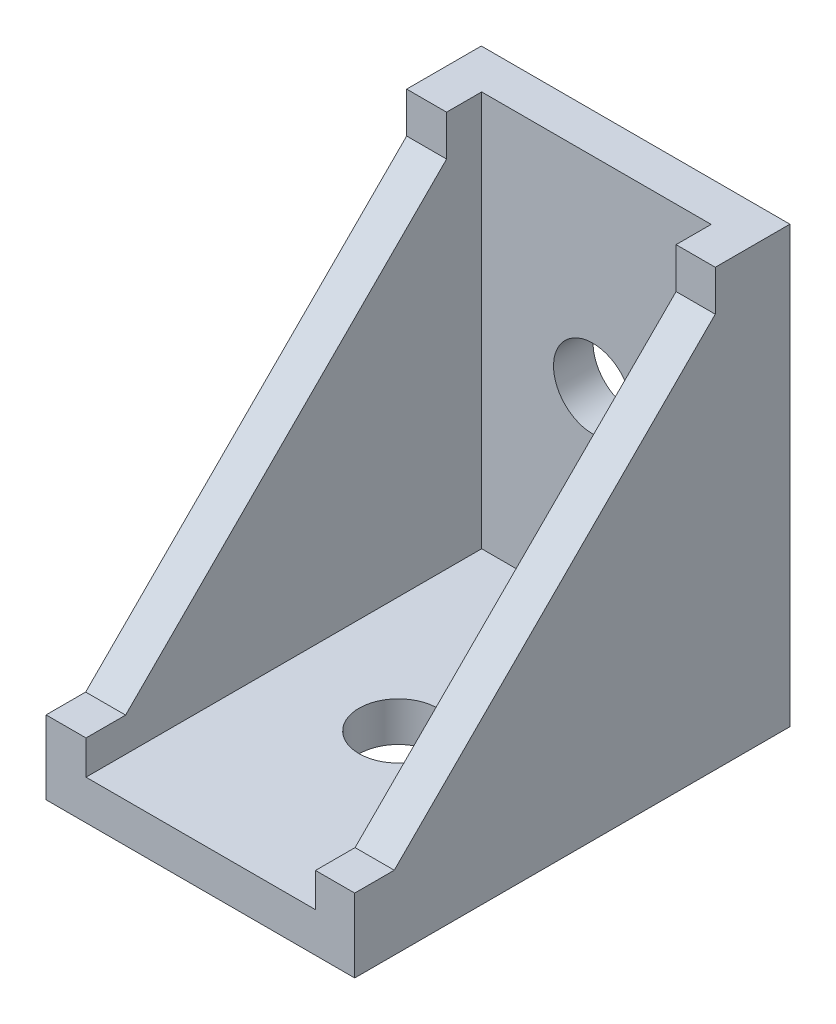
ISO-10303-21;
HEADER;
FILE_DESCRIPTION(('STEP AP214'),'2;1');
FILE_NAME('part.step','',(''),(''),'','','');
FILE_SCHEMA(('AUTOMOTIVE_DESIGN { 1 0 10303 214 1 1 1 1 }'));
ENDSEC;
DATA;
#1=APPLICATION_CONTEXT('core data for automotive mechanical design processes');
#2=APPLICATION_PROTOCOL_DEFINITION('international standard','automotive_design',2000,#1);
#3=PRODUCT_CONTEXT('',#1,'mechanical');
#4=PRODUCT('Part','Part','',(#3));
#5=PRODUCT_RELATED_PRODUCT_CATEGORY('part','',(#4));
#6=PRODUCT_DEFINITION_FORMATION('','',#4);
#7=PRODUCT_DEFINITION_CONTEXT('part definition',#1,'design');
#8=PRODUCT_DEFINITION('design','',#6,#7);
#9=PRODUCT_DEFINITION_SHAPE('','',#8);
#10=(LENGTH_UNIT() NAMED_UNIT(*) SI_UNIT(.MILLI.,.METRE.));
#11=(NAMED_UNIT(*) PLANE_ANGLE_UNIT() SI_UNIT($,.RADIAN.));
#12=(NAMED_UNIT(*) SI_UNIT($,.STERADIAN.) SOLID_ANGLE_UNIT());
#13=UNCERTAINTY_MEASURE_WITH_UNIT(LENGTH_MEASURE(1.E-05),#10,'distance_accuracy_value','');
#14=(GEOMETRIC_REPRESENTATION_CONTEXT(3) GLOBAL_UNCERTAINTY_ASSIGNED_CONTEXT((#13)) GLOBAL_UNIT_ASSIGNED_CONTEXT((#10,
#11,#12)) REPRESENTATION_CONTEXT('',''));
#15=CARTESIAN_POINT('',(0.,0.,0.));
#16=DIRECTION('',(0.,0.,1.));
#17=DIRECTION('',(1.,0.,0.));
#18=AXIS2_PLACEMENT_3D('',#15,#16,#17);
#19=CARTESIAN_POINT('',(0.,0.,27.94));
#20=DIRECTION('',(1.,0.,0.));
#21=DIRECTION('',(0.,1.,0.));
#22=AXIS2_PLACEMENT_3D('',#19,#20,#21);
#23=PLANE('',#22);
#24=DIRECTION('',(0.,0.,1.));
#25=VECTOR('',#24,1.);
#26=CARTESIAN_POINT('',(0.,-23.2176660016532,27.94));
#27=LINE('',#26,#25);
#28=CARTESIAN_POINT('',(0.,-23.2176660016532,25.4));
#29=VERTEX_POINT('',#28);
#30=CARTESIAN_POINT('',(0.,-23.2176660016532,27.94));
#31=VERTEX_POINT('',#30);
#32=EDGE_CURVE('E51',#29,#31,#27,.T.);
#33=ORIENTED_EDGE('',*,*,#32,.F.);
#34=DIRECTION('',(0.,-0.707106781186549,0.707106781186546));
#35=VECTOR('',#34,1.);
#36=CARTESIAN_POINT('',(0.,-12.8788330008266,15.0611669991734));
#37=LINE('',#36,#35);
#38=CARTESIAN_POINT('',(0.,-2.60963532653977,4.7919693248866));
#39=VERTEX_POINT('',#38);
#40=EDGE_CURVE('E55',#39,#29,#37,.T.);
#41=ORIENTED_EDGE('',*,*,#40,.F.);
#42=DIRECTION('',(0.,-1.,0.));
#43=VECTOR('',#42,1.);
#44=CARTESIAN_POINT('',(0.,0.,4.7919693248866));
#45=LINE('',#44,#43);
#46=CARTESIAN_POINT('',(0.,0.,4.7919693248866));
#47=VERTEX_POINT('',#46);
#48=EDGE_CURVE('E162',#47,#39,#45,.T.);
#49=ORIENTED_EDGE('',*,*,#48,.F.);
#50=DIRECTION('',(0.,0.,-1.));
#51=VECTOR('',#50,1.);
#52=CARTESIAN_POINT('',(0.,0.,27.94));
#53=LINE('',#52,#51);
#54=CARTESIAN_POINT('',(0.,0.,0.));
#55=VERTEX_POINT('',#54);
#56=EDGE_CURVE('E218',#47,#55,#53,.T.);
#57=ORIENTED_EDGE('',*,*,#56,.T.);
#58=DIRECTION('',(0.,-1.,0.));
#59=VECTOR('',#58,1.);
#60=CARTESIAN_POINT('',(0.,0.,0.));
#61=LINE('',#60,#59);
#62=CARTESIAN_POINT('',(0.,-27.94,0.));
#63=VERTEX_POINT('',#62);
#64=EDGE_CURVE('E202',#55,#63,#61,.T.);
#65=ORIENTED_EDGE('',*,*,#64,.T.);
#66=DIRECTION('',(0.,0.,-1.));
#67=VECTOR('',#66,1.);
#68=CARTESIAN_POINT('',(0.,-27.94,27.94));
#69=LINE('',#68,#67);
#70=CARTESIAN_POINT('',(0.,-27.94,27.94));
#71=VERTEX_POINT('',#70);
#72=EDGE_CURVE('E232',#71,#63,#69,.T.);
#73=ORIENTED_EDGE('',*,*,#72,.F.);
#74=DIRECTION('',(0.,-1.,0.));
#75=VECTOR('',#74,1.);
#76=CARTESIAN_POINT('',(0.,0.,27.94));
#77=LINE('',#76,#75);
#78=EDGE_CURVE('E210',#31,#71,#77,.T.);
#79=ORIENTED_EDGE('',*,*,#78,.F.);
#80=EDGE_LOOP('',(#33,#41,#49,#57,#65,#73,#79));
#81=FACE_BOUND('',#80,.T.);
#82=ADVANCED_FACE('F37',(#81),#23,.F.);
#83=CARTESIAN_POINT('',(19.812,0.,27.94));
#84=DIRECTION('',(-1.,0.,0.));
#85=DIRECTION('',(0.,-1.,0.));
#86=AXIS2_PLACEMENT_3D('',#83,#84,#85);
#87=PLANE('',#86);
#88=DIRECTION('',(0.,0.,-1.));
#89=VECTOR('',#88,1.);
#90=CARTESIAN_POINT('',(19.812,-23.2176660016532,27.94));
#91=LINE('',#90,#89);
#92=CARTESIAN_POINT('',(19.812,-23.2176660016532,27.94));
#93=VERTEX_POINT('',#92);
#94=CARTESIAN_POINT('',(19.812,-23.2176660016532,25.4));
#95=VERTEX_POINT('',#94);
#96=EDGE_CURVE('E177',#93,#95,#91,.T.);
#97=ORIENTED_EDGE('',*,*,#96,.F.);
#98=DIRECTION('',(0.,1.,0.));
#99=VECTOR('',#98,1.);
#100=CARTESIAN_POINT('',(19.812,0.,27.94));
#101=LINE('',#100,#99);
#102=CARTESIAN_POINT('',(19.812,-27.94,27.94));
#103=VERTEX_POINT('',#102);
#104=EDGE_CURVE('E215',#103,#93,#101,.T.);
#105=ORIENTED_EDGE('',*,*,#104,.F.);
#106=DIRECTION('',(0.,0.,-1.));
#107=VECTOR('',#106,1.);
#108=CARTESIAN_POINT('',(19.812,-27.94,27.94));
#109=LINE('',#108,#107);
#110=CARTESIAN_POINT('',(19.812,-27.94,0.));
#111=VERTEX_POINT('',#110);
#112=EDGE_CURVE('E229',#103,#111,#109,.T.);
#113=ORIENTED_EDGE('',*,*,#112,.T.);
#114=DIRECTION('',(0.,1.,0.));
#115=VECTOR('',#114,1.);
#116=CARTESIAN_POINT('',(19.812,0.,0.));
#117=LINE('',#116,#115);
#118=CARTESIAN_POINT('',(19.812,0.,0.));
#119=VERTEX_POINT('',#118);
#120=EDGE_CURVE('E223',#111,#119,#117,.T.);
#121=ORIENTED_EDGE('',*,*,#120,.T.);
#122=DIRECTION('',(0.,0.,-1.));
#123=VECTOR('',#122,1.);
#124=CARTESIAN_POINT('',(19.812,0.,27.94));
#125=LINE('',#124,#123);
#126=CARTESIAN_POINT('',(19.812,0.,4.7919693248866));
#127=VERTEX_POINT('',#126);
#128=EDGE_CURVE('E161',#127,#119,#125,.T.);
#129=ORIENTED_EDGE('',*,*,#128,.F.);
#130=DIRECTION('',(0.,1.,0.));
#131=VECTOR('',#130,1.);
#132=CARTESIAN_POINT('',(19.812,0.,4.7919693248866));
#133=LINE('',#132,#131);
#134=CARTESIAN_POINT('',(19.812,-2.60963532653976,4.7919693248866));
#135=VERTEX_POINT('',#134);
#136=EDGE_CURVE('E151',#135,#127,#133,.T.);
#137=ORIENTED_EDGE('',*,*,#136,.F.);
#138=DIRECTION('',(0.,0.707106781186549,-0.707106781186546));
#139=VECTOR('',#138,1.);
#140=CARTESIAN_POINT('',(19.812,-12.8788330008266,15.0611669991734));
#141=LINE('',#140,#139);
#142=EDGE_CURVE('E137',#95,#135,#141,.T.);
#143=ORIENTED_EDGE('',*,*,#142,.F.);
#144=EDGE_LOOP('',(#97,#105,#113,#121,#129,#137,#143));
#145=FACE_BOUND('',#144,.T.);
#146=ADVANCED_FACE('F159',(#145),#87,.F.);
#147=CARTESIAN_POINT('',(0.,0.,27.94));
#148=DIRECTION('',(0.,-1.,0.));
#149=DIRECTION('',(0.,0.,-1.));
#150=AXIS2_PLACEMENT_3D('',#147,#148,#149);
#151=PLANE('',#150);
#152=DIRECTION('',(-1.,0.,0.));
#153=VECTOR('',#152,1.);
#154=CARTESIAN_POINT('',(99.8292983684842,0.,4.7919693248866));
#155=LINE('',#154,#153);
#156=CARTESIAN_POINT('',(17.2955018595137,0.,4.7919693248866));
#157=VERTEX_POINT('',#156);
#158=EDGE_CURVE('E245',#127,#157,#155,.T.);
#159=ORIENTED_EDGE('',*,*,#158,.F.);
#160=ORIENTED_EDGE('',*,*,#128,.T.);
#161=DIRECTION('',(-1.,0.,0.));
#162=VECTOR('',#161,1.);
#163=CARTESIAN_POINT('',(0.,0.,0.));
#164=LINE('',#163,#162);
#165=EDGE_CURVE('E213',#119,#55,#164,.T.);
#166=ORIENTED_EDGE('',*,*,#165,.T.);
#167=ORIENTED_EDGE('',*,*,#56,.F.);
#168=CARTESIAN_POINT('',(2.56350185951372,0.,4.7919693248866));
#169=VERTEX_POINT('',#168);
#170=EDGE_CURVE('E155',#169,#47,#155,.T.);
#171=ORIENTED_EDGE('',*,*,#170,.F.);
#172=DIRECTION('',(0.,0.,1.));
#173=VECTOR('',#172,1.);
#174=CARTESIAN_POINT('',(2.56350185951372,0.,2.54));
#175=LINE('',#174,#173);
#176=CARTESIAN_POINT('',(2.56350185951372,0.,2.54));
#177=VERTEX_POINT('',#176);
#178=EDGE_CURVE('E203',#177,#169,#175,.T.);
#179=ORIENTED_EDGE('',*,*,#178,.F.);
#180=DIRECTION('',(1.,0.,0.));
#181=VECTOR('',#180,1.);
#182=CARTESIAN_POINT('',(2.56350185951372,0.,2.54));
#183=LINE('',#182,#181);
#184=CARTESIAN_POINT('',(17.2955018595137,0.,2.54));
#185=VERTEX_POINT('',#184);
#186=EDGE_CURVE('E187',#177,#185,#183,.T.);
#187=ORIENTED_EDGE('',*,*,#186,.T.);
#188=DIRECTION('',(0.,0.,1.));
#189=VECTOR('',#188,1.);
#190=CARTESIAN_POINT('',(17.2955018595137,0.,2.54));
#191=LINE('',#190,#189);
#192=EDGE_CURVE('E205',#185,#157,#191,.T.);
#193=ORIENTED_EDGE('',*,*,#192,.T.);
#194=EDGE_LOOP('',(#159,#160,#166,#167,#171,#179,#187,#193));
#195=FACE_BOUND('',#194,.T.);
#196=ADVANCED_FACE('F277',(#195),#151,.F.);
#197=CARTESIAN_POINT('',(0.,0.,27.94));
#198=DIRECTION('',(0.,0.,1.));
#199=DIRECTION('',(1.,0.,0.));
#200=AXIS2_PLACEMENT_3D('',#197,#198,#199);
#201=PLANE('',#200);
#202=ORIENTED_EDGE('',*,*,#104,.T.);
#203=DIRECTION('',(-1.,0.,0.));
#204=VECTOR('',#203,1.);
#205=CARTESIAN_POINT('',(99.8292983684842,-23.2176660016532,27.94));
#206=LINE('',#205,#204);
#207=CARTESIAN_POINT('',(17.2955018595137,-23.2176660016532,27.94));
#208=VERTEX_POINT('',#207);
#209=EDGE_CURVE('E167',#93,#208,#206,.T.);
#210=ORIENTED_EDGE('',*,*,#209,.T.);
#211=DIRECTION('',(0.,-1.,0.));
#212=VECTOR('',#211,1.);
#213=CARTESIAN_POINT('',(17.2955018595137,0.,27.94));
#214=LINE('',#213,#212);
#215=CARTESIAN_POINT('',(17.2955018595137,-25.4,27.94));
#216=VERTEX_POINT('',#215);
#217=EDGE_CURVE('E196',#208,#216,#214,.T.);
#218=ORIENTED_EDGE('',*,*,#217,.T.);
#219=DIRECTION('',(1.,0.,0.));
#220=VECTOR('',#219,1.);
#221=CARTESIAN_POINT('',(2.56350185951372,-25.4,27.94));
#222=LINE('',#221,#220);
#223=CARTESIAN_POINT('',(2.56350185951372,-25.4,27.94));
#224=VERTEX_POINT('',#223);
#225=EDGE_CURVE('E180',#224,#216,#222,.T.);
#226=ORIENTED_EDGE('',*,*,#225,.F.);
#227=DIRECTION('',(0.,-1.,0.));
#228=VECTOR('',#227,1.);
#229=CARTESIAN_POINT('',(2.56350185951372,0.,27.94));
#230=LINE('',#229,#228);
#231=CARTESIAN_POINT('',(2.56350185951372,-23.2176660016532,27.94));
#232=VERTEX_POINT('',#231);
#233=EDGE_CURVE('E185',#232,#224,#230,.T.);
#234=ORIENTED_EDGE('',*,*,#233,.F.);
#235=EDGE_CURVE('E241',#232,#31,#206,.T.);
#236=ORIENTED_EDGE('',*,*,#235,.T.);
#237=ORIENTED_EDGE('',*,*,#78,.T.);
#238=DIRECTION('',(1.,0.,0.));
#239=VECTOR('',#238,1.);
#240=CARTESIAN_POINT('',(0.,-27.94,27.94));
#241=LINE('',#240,#239);
#242=EDGE_CURVE('E212',#71,#103,#241,.T.);
#243=ORIENTED_EDGE('',*,*,#242,.T.);
#244=EDGE_LOOP('',(#202,#210,#218,#226,#234,#236,#237,#243));
#245=FACE_BOUND('',#244,.T.);
#246=ADVANCED_FACE('F285',(#245),#201,.T.);
#247=CARTESIAN_POINT('',(2.56350185951372,0.,2.54));
#248=DIRECTION('',(-1.,0.,0.));
#249=DIRECTION('',(0.,0.,1.));
#250=AXIS2_PLACEMENT_3D('',#247,#248,#249);
#251=PLANE('',#250);
#252=DIRECTION('',(0.,0.,-1.));
#253=VECTOR('',#252,1.);
#254=CARTESIAN_POINT('',(2.56350185951372,-23.2176660016532,2.54));
#255=LINE('',#254,#253);
#256=CARTESIAN_POINT('',(2.56350185951372,-23.2176660016532,25.4));
#257=VERTEX_POINT('',#256);
#258=EDGE_CURVE('E174',#232,#257,#255,.T.);
#259=ORIENTED_EDGE('',*,*,#258,.F.);
#260=ORIENTED_EDGE('',*,*,#233,.T.);
#261=DIRECTION('',(0.,0.,1.));
#262=VECTOR('',#261,1.);
#263=CARTESIAN_POINT('',(2.56350185951372,-25.4,2.54));
#264=LINE('',#263,#262);
#265=CARTESIAN_POINT('',(2.56350185951372,-25.4,2.54));
#266=VERTEX_POINT('',#265);
#267=EDGE_CURVE('E199',#266,#224,#264,.T.);
#268=ORIENTED_EDGE('',*,*,#267,.F.);
#269=DIRECTION('',(0.,-1.,0.));
#270=VECTOR('',#269,1.);
#271=CARTESIAN_POINT('',(2.56350185951372,0.,2.54));
#272=LINE('',#271,#270);
#273=EDGE_CURVE('E190',#177,#266,#272,.T.);
#274=ORIENTED_EDGE('',*,*,#273,.F.);
#275=ORIENTED_EDGE('',*,*,#178,.T.);
#276=DIRECTION('',(0.,1.,0.));
#277=VECTOR('',#276,1.);
#278=CARTESIAN_POINT('',(2.56350185951372,0.,4.7919693248866));
#279=LINE('',#278,#277);
#280=CARTESIAN_POINT('',(2.56350185951372,-2.60963532653977,4.7919693248866));
#281=VERTEX_POINT('',#280);
#282=EDGE_CURVE('E163',#281,#169,#279,.T.);
#283=ORIENTED_EDGE('',*,*,#282,.F.);
#284=DIRECTION('',(0.,0.707106781186549,-0.707106781186546));
#285=VECTOR('',#284,1.);
#286=CARTESIAN_POINT('',(2.56350185951372,-0.178833000826582,2.36116699917342));
#287=LINE('',#286,#285);
#288=EDGE_CURVE('E147',#257,#281,#287,.T.);
#289=ORIENTED_EDGE('',*,*,#288,.F.);
#290=EDGE_LOOP('',(#259,#260,#268,#274,#275,#283,#289));
#291=FACE_BOUND('',#290,.T.);
#292=ADVANCED_FACE('F281',(#291),#251,.F.);
#293=CARTESIAN_POINT('',(17.2955018595137,0.,2.54));
#294=DIRECTION('',(-1.,0.,0.));
#295=DIRECTION('',(0.,-1.,0.));
#296=AXIS2_PLACEMENT_3D('',#293,#294,#295);
#297=PLANE('',#296);
#298=ORIENTED_EDGE('',*,*,#217,.F.);
#299=DIRECTION('',(0.,0.,-1.));
#300=VECTOR('',#299,1.);
#301=CARTESIAN_POINT('',(17.2955018595137,-23.2176660016532,2.54));
#302=LINE('',#301,#300);
#303=CARTESIAN_POINT('',(17.2955018595137,-23.2176660016532,25.4));
#304=VERTEX_POINT('',#303);
#305=EDGE_CURVE('E11',#208,#304,#302,.T.);
#306=ORIENTED_EDGE('',*,*,#305,.T.);
#307=DIRECTION('',(0.,0.707106781186549,-0.707106781186546));
#308=VECTOR('',#307,1.);
#309=CARTESIAN_POINT('',(17.2955018595137,-0.178833000826582,2.36116699917342));
#310=LINE('',#309,#308);
#311=CARTESIAN_POINT('',(17.2955018595137,-2.60963532653976,4.7919693248866));
#312=VERTEX_POINT('',#311);
#313=EDGE_CURVE('E44',#304,#312,#310,.T.);
#314=ORIENTED_EDGE('',*,*,#313,.T.);
#315=DIRECTION('',(0.,1.,0.));
#316=VECTOR('',#315,1.);
#317=CARTESIAN_POINT('',(17.2955018595137,0.,4.7919693248866));
#318=LINE('',#317,#316);
#319=EDGE_CURVE('E154',#312,#157,#318,.T.);
#320=ORIENTED_EDGE('',*,*,#319,.T.);
#321=ORIENTED_EDGE('',*,*,#192,.F.);
#322=DIRECTION('',(0.,-1.,0.));
#323=VECTOR('',#322,1.);
#324=CARTESIAN_POINT('',(17.2955018595137,0.,2.54));
#325=LINE('',#324,#323);
#326=CARTESIAN_POINT('',(17.2955018595137,-25.4,2.54));
#327=VERTEX_POINT('',#326);
#328=EDGE_CURVE('E184',#185,#327,#325,.T.);
#329=ORIENTED_EDGE('',*,*,#328,.T.);
#330=DIRECTION('',(0.,0.,1.));
#331=VECTOR('',#330,1.);
#332=CARTESIAN_POINT('',(17.2955018595137,-25.4,2.54));
#333=LINE('',#332,#331);
#334=EDGE_CURVE('E193',#327,#216,#333,.T.);
#335=ORIENTED_EDGE('',*,*,#334,.T.);
#336=EDGE_LOOP('',(#298,#306,#314,#320,#321,#329,#335));
#337=FACE_BOUND('',#336,.T.);
#338=ADVANCED_FACE('F237',(#337),#297,.T.);
#339=CARTESIAN_POINT('',(0.,-27.94,27.94));
#340=DIRECTION('',(0.,1.,0.));
#341=DIRECTION('',(0.,0.,1.));
#342=AXIS2_PLACEMENT_3D('',#339,#340,#341);
#343=PLANE('',#342);
#344=CARTESIAN_POINT('',(10.0166400718044,-27.94,15.3437808915717));
#345=DIRECTION('',(0.,1.,0.));
#346=DIRECTION('',(0.,0.,1.));
#347=AXIS2_PLACEMENT_3D('',#344,#345,#346);
#348=CIRCLE('',#347,2.5273);
#349=CARTESIAN_POINT('',(10.0166400718044,-27.94,17.8710808915717));
#350=VERTEX_POINT('',#349);
#351=EDGE_CURVE('E248',#350,#350,#348,.T.);
#352=ORIENTED_EDGE('',*,*,#351,.T.);
#353=EDGE_LOOP('',(#352));
#354=FACE_BOUND('',#353,.T.);
#355=DIRECTION('',(1.,0.,0.));
#356=VECTOR('',#355,1.);
#357=CARTESIAN_POINT('',(0.,-27.94,0.));
#358=LINE('',#357,#356);
#359=EDGE_CURVE('E221',#63,#111,#358,.T.);
#360=ORIENTED_EDGE('',*,*,#359,.T.);
#361=ORIENTED_EDGE('',*,*,#112,.F.);
#362=ORIENTED_EDGE('',*,*,#242,.F.);
#363=ORIENTED_EDGE('',*,*,#72,.T.);
#364=EDGE_LOOP('',(#360,#361,#362,#363));
#365=FACE_BOUND('',#364,.T.);
#366=ADVANCED_FACE('F303',(#354,#365),#343,.F.);
#367=CARTESIAN_POINT('',(0.,0.,0.));
#368=DIRECTION('',(0.,0.,1.));
#369=DIRECTION('',(1.,0.,0.));
#370=AXIS2_PLACEMENT_3D('',#367,#368,#369);
#371=PLANE('',#370);
#372=CARTESIAN_POINT('',(9.70315986835855,-12.9281393238417,0.));
#373=DIRECTION('',(0.,0.,1.));
#374=DIRECTION('',(1.,0.,0.));
#375=AXIS2_PLACEMENT_3D('',#372,#373,#374);
#376=CIRCLE('',#375,2.52729999999999);
#377=CARTESIAN_POINT('',(12.2304598683585,-12.9281393238417,0.));
#378=VERTEX_POINT('',#377);
#379=EDGE_CURVE('E256',#378,#378,#376,.T.);
#380=ORIENTED_EDGE('',*,*,#379,.T.);
#381=EDGE_LOOP('',(#380));
#382=FACE_BOUND('',#381,.T.);
#383=ORIENTED_EDGE('',*,*,#64,.F.);
#384=ORIENTED_EDGE('',*,*,#165,.F.);
#385=ORIENTED_EDGE('',*,*,#120,.F.);
#386=ORIENTED_EDGE('',*,*,#359,.F.);
#387=EDGE_LOOP('',(#383,#384,#385,#386));
#388=FACE_BOUND('',#387,.T.);
#389=ADVANCED_FACE('F299',(#382,#388),#371,.F.);
#390=CARTESIAN_POINT('',(2.56350185951372,-25.4,2.54));
#391=DIRECTION('',(0.,-1.,0.));
#392=DIRECTION('',(0.,0.,-1.));
#393=AXIS2_PLACEMENT_3D('',#390,#391,#392);
#394=PLANE('',#393);
#395=CARTESIAN_POINT('',(10.0166400718044,-25.4,15.3437808915717));
#396=DIRECTION('',(0.,1.,0.));
#397=DIRECTION('',(0.,0.,1.));
#398=AXIS2_PLACEMENT_3D('',#395,#396,#397);
#399=CIRCLE('',#398,2.5273);
#400=CARTESIAN_POINT('',(10.0166400718044,-25.4,17.8710808915717));
#401=VERTEX_POINT('',#400);
#402=EDGE_CURVE('E253',#401,#401,#399,.T.);
#403=ORIENTED_EDGE('',*,*,#402,.F.);
#404=EDGE_LOOP('',(#403));
#405=FACE_BOUND('',#404,.T.);
#406=ORIENTED_EDGE('',*,*,#225,.T.);
#407=ORIENTED_EDGE('',*,*,#334,.F.);
#408=DIRECTION('',(1.,0.,0.));
#409=VECTOR('',#408,1.);
#410=CARTESIAN_POINT('',(2.56350185951372,-25.4,2.54));
#411=LINE('',#410,#409);
#412=EDGE_CURVE('E181',#266,#327,#411,.T.);
#413=ORIENTED_EDGE('',*,*,#412,.F.);
#414=ORIENTED_EDGE('',*,*,#267,.T.);
#415=EDGE_LOOP('',(#406,#407,#413,#414));
#416=FACE_BOUND('',#415,.T.);
#417=ADVANCED_FACE('F268',(#405,#416),#394,.F.);
#418=CARTESIAN_POINT('',(0.,0.,2.54));
#419=DIRECTION('',(0.,0.,-1.));
#420=DIRECTION('',(-1.,0.,0.));
#421=AXIS2_PLACEMENT_3D('',#418,#419,#420);
#422=PLANE('',#421);
#423=CARTESIAN_POINT('',(9.70315986835855,-12.9281393238417,2.54000000000001));
#424=DIRECTION('',(0.,0.,1.));
#425=DIRECTION('',(1.,0.,0.));
#426=AXIS2_PLACEMENT_3D('',#423,#424,#425);
#427=CIRCLE('',#426,2.52729999999999);
#428=CARTESIAN_POINT('',(12.2304598683585,-12.9281393238417,2.54000000000001));
#429=VERTEX_POINT('',#428);
#430=EDGE_CURVE('E259',#429,#429,#427,.T.);
#431=ORIENTED_EDGE('',*,*,#430,.F.);
#432=EDGE_LOOP('',(#431));
#433=FACE_BOUND('',#432,.T.);
#434=ORIENTED_EDGE('',*,*,#412,.T.);
#435=ORIENTED_EDGE('',*,*,#328,.F.);
#436=ORIENTED_EDGE('',*,*,#186,.F.);
#437=ORIENTED_EDGE('',*,*,#273,.T.);
#438=EDGE_LOOP('',(#434,#435,#436,#437));
#439=FACE_BOUND('',#438,.T.);
#440=ADVANCED_FACE('F265',(#433,#439),#422,.F.);
#441=CARTESIAN_POINT('',(99.8292983684842,-2.60963532653975,4.7919693248866));
#442=DIRECTION('',(0.,0.,1.));
#443=DIRECTION('',(1.,0.,0.));
#444=AXIS2_PLACEMENT_3D('',#441,#442,#443);
#445=PLANE('',#444);
#446=DIRECTION('',(-1.,0.,0.));
#447=VECTOR('',#446,1.);
#448=CARTESIAN_POINT('',(99.8292983684842,-2.60963532653975,4.7919693248866));
#449=LINE('',#448,#447);
#450=EDGE_CURVE('E140',#135,#312,#449,.T.);
#451=ORIENTED_EDGE('',*,*,#450,.F.);
#452=ORIENTED_EDGE('',*,*,#136,.T.);
#453=ORIENTED_EDGE('',*,*,#158,.T.);
#454=ORIENTED_EDGE('',*,*,#319,.F.);
#455=EDGE_LOOP('',(#451,#452,#453,#454));
#456=FACE_BOUND('',#455,.T.);
#457=ADVANCED_FACE('F150',(#456),#445,.T.);
#458=CARTESIAN_POINT('',(99.8292983684842,-23.2176660016532,25.4));
#459=DIRECTION('',(0.,0.707106781186546,0.707106781186549));
#460=DIRECTION('',(0.,-0.707106781186549,0.707106781186546));
#461=AXIS2_PLACEMENT_3D('',#458,#459,#460);
#462=PLANE('',#461);
#463=DIRECTION('',(-1.,0.,0.));
#464=VECTOR('',#463,1.);
#465=CARTESIAN_POINT('',(99.8292983684842,-23.2176660016532,25.4));
#466=LINE('',#465,#464);
#467=EDGE_CURVE('E143',#95,#304,#466,.T.);
#468=ORIENTED_EDGE('',*,*,#467,.F.);
#469=ORIENTED_EDGE('',*,*,#142,.T.);
#470=ORIENTED_EDGE('',*,*,#450,.T.);
#471=ORIENTED_EDGE('',*,*,#313,.F.);
#472=EDGE_LOOP('',(#468,#469,#470,#471));
#473=FACE_BOUND('',#472,.T.);
#474=ADVANCED_FACE('F139',(#473),#462,.T.);
#475=CARTESIAN_POINT('',(99.8292983684842,-23.2176660016532,27.94));
#476=DIRECTION('',(0.,1.,0.));
#477=DIRECTION('',(-1.,0.,0.));
#478=AXIS2_PLACEMENT_3D('',#475,#476,#477);
#479=PLANE('',#478);
#480=ORIENTED_EDGE('',*,*,#209,.F.);
#481=ORIENTED_EDGE('',*,*,#96,.T.);
#482=ORIENTED_EDGE('',*,*,#467,.T.);
#483=ORIENTED_EDGE('',*,*,#305,.F.);
#484=EDGE_LOOP('',(#480,#481,#482,#483));
#485=FACE_BOUND('',#484,.T.);
#486=ADVANCED_FACE('F239',(#485),#479,.T.);
#487=EDGE_CURVE('E242',#257,#29,#466,.T.);
#488=ORIENTED_EDGE('',*,*,#487,.T.);
#489=ORIENTED_EDGE('',*,*,#32,.T.);
#490=ORIENTED_EDGE('',*,*,#235,.F.);
#491=ORIENTED_EDGE('',*,*,#258,.T.);
#492=EDGE_LOOP('',(#488,#489,#490,#491));
#493=FACE_BOUND('',#492,.T.);
#494=ADVANCED_FACE('F287',(#493),#479,.T.);
#495=EDGE_CURVE('E156',#281,#39,#449,.T.);
#496=ORIENTED_EDGE('',*,*,#495,.T.);
#497=ORIENTED_EDGE('',*,*,#40,.T.);
#498=ORIENTED_EDGE('',*,*,#487,.F.);
#499=ORIENTED_EDGE('',*,*,#288,.T.);
#500=EDGE_LOOP('',(#496,#497,#498,#499));
#501=FACE_BOUND('',#500,.T.);
#502=ADVANCED_FACE('F290',(#501),#462,.T.);
#503=ORIENTED_EDGE('',*,*,#170,.T.);
#504=ORIENTED_EDGE('',*,*,#48,.T.);
#505=ORIENTED_EDGE('',*,*,#495,.F.);
#506=ORIENTED_EDGE('',*,*,#282,.T.);
#507=EDGE_LOOP('',(#503,#504,#505,#506));
#508=FACE_BOUND('',#507,.T.);
#509=ADVANCED_FACE('F293',(#508),#445,.T.);
#510=CARTESIAN_POINT('',(10.0166400718044,-25.4,15.3437808915717));
#511=DIRECTION('',(0.,1.,0.));
#512=DIRECTION('',(0.,0.,1.));
#513=AXIS2_PLACEMENT_3D('',#510,#511,#512);
#514=CYLINDRICAL_SURFACE('',#513,2.5273);
#515=ORIENTED_EDGE('',*,*,#351,.F.);
#516=EDGE_LOOP('',(#515));
#517=FACE_BOUND('',#516,.T.);
#518=ORIENTED_EDGE('',*,*,#402,.T.);
#519=EDGE_LOOP('',(#518));
#520=FACE_BOUND('',#519,.T.);
#521=ADVANCED_FACE('F338',(#517,#520),#514,.F.);
#522=CARTESIAN_POINT('',(9.70315986835855,-12.9281393238417,2.54));
#523=DIRECTION('',(0.,0.,1.));
#524=DIRECTION('',(1.,0.,0.));
#525=AXIS2_PLACEMENT_3D('',#522,#523,#524);
#526=CYLINDRICAL_SURFACE('',#525,2.52729999999999);
#527=ORIENTED_EDGE('',*,*,#379,.F.);
#528=EDGE_LOOP('',(#527));
#529=FACE_BOUND('',#528,.T.);
#530=ORIENTED_EDGE('',*,*,#430,.T.);
#531=EDGE_LOOP('',(#530));
#532=FACE_BOUND('',#531,.T.);
#533=ADVANCED_FACE('F263',(#529,#532),#526,.F.);
#534=CLOSED_SHELL('',(#82,#146,#196,#246,#292,#338,#366,#389,#417,#440,#457,#474,#486,#494,#502,
#509,#521,#533));
#535=MANIFOLD_SOLID_BREP('B2',#534);
#536=ADVANCED_BREP_SHAPE_REPRESENTATION('',(#18,#535),#14);
#537=SHAPE_DEFINITION_REPRESENTATION(#9,#536);
ENDSEC;
END-ISO-10303-21;
